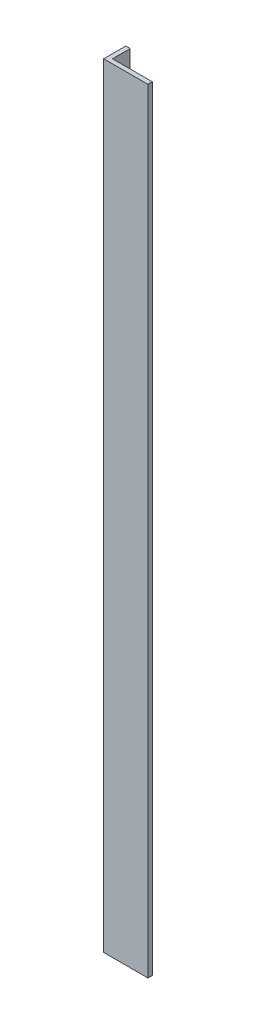
ISO-10303-21;
HEADER;
FILE_DESCRIPTION(('STEP AP214'),'2;1');
FILE_NAME('part.step','',(''),(''),'','','');
FILE_SCHEMA(('AUTOMOTIVE_DESIGN { 1 0 10303 214 1 1 1 1 }'));
ENDSEC;
DATA;
#1=APPLICATION_CONTEXT('core data for automotive mechanical design processes');
#2=APPLICATION_PROTOCOL_DEFINITION('international standard','automotive_design',2000,#1);
#3=PRODUCT_CONTEXT('',#1,'mechanical');
#4=PRODUCT('Part','Part','',(#3));
#5=PRODUCT_RELATED_PRODUCT_CATEGORY('part','',(#4));
#6=PRODUCT_DEFINITION_FORMATION('','',#4);
#7=PRODUCT_DEFINITION_CONTEXT('part definition',#1,'design');
#8=PRODUCT_DEFINITION('design','',#6,#7);
#9=PRODUCT_DEFINITION_SHAPE('','',#8);
#10=(LENGTH_UNIT() NAMED_UNIT(*) SI_UNIT(.MILLI.,.METRE.));
#11=(NAMED_UNIT(*) PLANE_ANGLE_UNIT() SI_UNIT($,.RADIAN.));
#12=(NAMED_UNIT(*) SI_UNIT($,.STERADIAN.) SOLID_ANGLE_UNIT());
#13=UNCERTAINTY_MEASURE_WITH_UNIT(LENGTH_MEASURE(1.E-05),#10,'distance_accuracy_value','');
#14=(GEOMETRIC_REPRESENTATION_CONTEXT(3) GLOBAL_UNCERTAINTY_ASSIGNED_CONTEXT((#13)) GLOBAL_UNIT_ASSIGNED_CONTEXT((#10,
#11,#12)) REPRESENTATION_CONTEXT('',''));
#15=CARTESIAN_POINT('',(0.,0.,0.));
#16=DIRECTION('',(0.,0.,1.));
#17=DIRECTION('',(1.,0.,0.));
#18=AXIS2_PLACEMENT_3D('',#15,#16,#17);
#19=CARTESIAN_POINT('',(0.,0.,0.));
#20=DIRECTION('',(0.,-1.,0.));
#21=DIRECTION('',(0.,0.,-1.));
#22=AXIS2_PLACEMENT_3D('',#19,#20,#21);
#23=PLANE('',#22);
#24=DIRECTION('',(1.,0.,0.));
#25=VECTOR('',#24,1.);
#26=CARTESIAN_POINT('',(20.,0.,0.));
#27=LINE('',#26,#25);
#28=CARTESIAN_POINT('',(0.,0.,0.));
#29=VERTEX_POINT('',#28);
#30=CARTESIAN_POINT('',(20.,0.,0.));
#31=VERTEX_POINT('',#30);
#32=EDGE_CURVE('E100',#29,#31,#27,.T.);
#33=ORIENTED_EDGE('',*,*,#32,.F.);
#34=DIRECTION('',(0.,0.,1.));
#35=VECTOR('',#34,1.);
#36=CARTESIAN_POINT('',(0.,0.,0.));
#37=LINE('',#36,#35);
#38=CARTESIAN_POINT('',(0.,0.,-10.));
#39=VERTEX_POINT('',#38);
#40=EDGE_CURVE('E118',#39,#29,#37,.T.);
#41=ORIENTED_EDGE('',*,*,#40,.F.);
#42=DIRECTION('',(-1.,0.,0.));
#43=VECTOR('',#42,1.);
#44=CARTESIAN_POINT('',(0.,0.,-10.));
#45=LINE('',#44,#43);
#46=CARTESIAN_POINT('',(2.,0.,-10.));
#47=VERTEX_POINT('',#46);
#48=EDGE_CURVE('E115',#47,#39,#45,.T.);
#49=ORIENTED_EDGE('',*,*,#48,.F.);
#50=DIRECTION('',(0.,0.,-1.));
#51=VECTOR('',#50,1.);
#52=CARTESIAN_POINT('',(2.,0.,-10.));
#53=LINE('',#52,#51);
#54=CARTESIAN_POINT('',(2.,0.,-2.));
#55=VERTEX_POINT('',#54);
#56=EDGE_CURVE('E112',#55,#47,#53,.T.);
#57=ORIENTED_EDGE('',*,*,#56,.F.);
#58=DIRECTION('',(-1.,0.,0.));
#59=VECTOR('',#58,1.);
#60=CARTESIAN_POINT('',(2.,0.,-2.));
#61=LINE('',#60,#59);
#62=CARTESIAN_POINT('',(20.,0.,-2.));
#63=VERTEX_POINT('',#62);
#64=EDGE_CURVE('E103',#63,#55,#61,.T.);
#65=ORIENTED_EDGE('',*,*,#64,.F.);
#66=DIRECTION('',(0.,0.,-1.));
#67=VECTOR('',#66,1.);
#68=CARTESIAN_POINT('',(20.,0.,-2.));
#69=LINE('',#68,#67);
#70=EDGE_CURVE('E92',#31,#63,#69,.T.);
#71=ORIENTED_EDGE('',*,*,#70,.F.);
#72=EDGE_LOOP('',(#33,#41,#49,#57,#65,#71));
#73=FACE_BOUND('',#72,.T.);
#74=ADVANCED_FACE('F36',(#73),#23,.T.);
#75=CARTESIAN_POINT('',(0.,372.360679774998,0.));
#76=DIRECTION('',(1.,0.,0.));
#77=DIRECTION('',(0.,0.,-1.));
#78=AXIS2_PLACEMENT_3D('',#75,#76,#77);
#79=PLANE('',#78);
#80=DIRECTION('',(0.,-1.,0.));
#81=VECTOR('',#80,1.);
#82=CARTESIAN_POINT('',(0.,372.360679774998,0.));
#83=LINE('',#82,#81);
#84=CARTESIAN_POINT('',(1.62786450985655E-13,350.,0.));
#85=VERTEX_POINT('',#84);
#86=EDGE_CURVE('E106',#85,#29,#83,.T.);
#87=ORIENTED_EDGE('',*,*,#86,.F.);
#88=DIRECTION('',(0.,0.,-1.));
#89=VECTOR('',#88,1.);
#90=CARTESIAN_POINT('',(0.,350.,0.));
#91=LINE('',#90,#89);
#92=CARTESIAN_POINT('',(0.,350.,-10.));
#93=VERTEX_POINT('',#92);
#94=EDGE_CURVE('E40',#85,#93,#91,.T.);
#95=ORIENTED_EDGE('',*,*,#94,.T.);
#96=DIRECTION('',(0.,-1.,0.));
#97=VECTOR('',#96,1.);
#98=CARTESIAN_POINT('',(0.,372.360679774998,-10.));
#99=LINE('',#98,#97);
#100=EDGE_CURVE('E121',#93,#39,#99,.T.);
#101=ORIENTED_EDGE('',*,*,#100,.T.);
#102=ORIENTED_EDGE('',*,*,#40,.T.);
#103=EDGE_LOOP('',(#87,#95,#101,#102));
#104=FACE_BOUND('',#103,.T.);
#105=ADVANCED_FACE('F140',(#104),#79,.F.);
#106=CARTESIAN_POINT('',(0.,372.360679774998,-10.));
#107=DIRECTION('',(0.,0.,1.));
#108=DIRECTION('',(1.,0.,0.));
#109=AXIS2_PLACEMENT_3D('',#106,#107,#108);
#110=PLANE('',#109);
#111=ORIENTED_EDGE('',*,*,#100,.F.);
#112=DIRECTION('',(1.,0.,0.));
#113=VECTOR('',#112,1.);
#114=CARTESIAN_POINT('',(0.,350.,-10.));
#115=LINE('',#114,#113);
#116=CARTESIAN_POINT('',(2.,350.,-10.));
#117=VERTEX_POINT('',#116);
#118=EDGE_CURVE('E132',#93,#117,#115,.T.);
#119=ORIENTED_EDGE('',*,*,#118,.T.);
#120=DIRECTION('',(0.,-1.,0.));
#121=VECTOR('',#120,1.);
#122=CARTESIAN_POINT('',(2.,372.360679774998,-10.));
#123=LINE('',#122,#121);
#124=EDGE_CURVE('E123',#117,#47,#123,.T.);
#125=ORIENTED_EDGE('',*,*,#124,.T.);
#126=ORIENTED_EDGE('',*,*,#48,.T.);
#127=EDGE_LOOP('',(#111,#119,#125,#126));
#128=FACE_BOUND('',#127,.T.);
#129=ADVANCED_FACE('F143',(#128),#110,.F.);
#130=CARTESIAN_POINT('',(2.,372.360679774998,-10.));
#131=DIRECTION('',(-1.,0.,0.));
#132=DIRECTION('',(0.,0.,1.));
#133=AXIS2_PLACEMENT_3D('',#130,#131,#132);
#134=PLANE('',#133);
#135=ORIENTED_EDGE('',*,*,#124,.F.);
#136=DIRECTION('',(0.,0.,1.));
#137=VECTOR('',#136,1.);
#138=CARTESIAN_POINT('',(2.,350.,-10.));
#139=LINE('',#138,#137);
#140=CARTESIAN_POINT('',(2.,350.,-2.));
#141=VERTEX_POINT('',#140);
#142=EDGE_CURVE('E130',#117,#141,#139,.T.);
#143=ORIENTED_EDGE('',*,*,#142,.T.);
#144=DIRECTION('',(0.,-1.,0.));
#145=VECTOR('',#144,1.);
#146=CARTESIAN_POINT('',(2.,372.360679774998,-2.));
#147=LINE('',#146,#145);
#148=EDGE_CURVE('E125',#141,#55,#147,.T.);
#149=ORIENTED_EDGE('',*,*,#148,.T.);
#150=ORIENTED_EDGE('',*,*,#56,.T.);
#151=EDGE_LOOP('',(#135,#143,#149,#150));
#152=FACE_BOUND('',#151,.T.);
#153=ADVANCED_FACE('F146',(#152),#134,.F.);
#154=CARTESIAN_POINT('',(2.,372.360679774998,-2.));
#155=DIRECTION('',(0.,0.,1.));
#156=DIRECTION('',(1.,0.,0.));
#157=AXIS2_PLACEMENT_3D('',#154,#155,#156);
#158=PLANE('',#157);
#159=ORIENTED_EDGE('',*,*,#148,.F.);
#160=DIRECTION('',(1.,0.,0.));
#161=VECTOR('',#160,1.);
#162=CARTESIAN_POINT('',(2.,350.,-2.));
#163=LINE('',#162,#161);
#164=CARTESIAN_POINT('',(20.,350.,-2.));
#165=VERTEX_POINT('',#164);
#166=EDGE_CURVE('E57',#141,#165,#163,.T.);
#167=ORIENTED_EDGE('',*,*,#166,.T.);
#168=DIRECTION('',(0.,-1.,0.));
#169=VECTOR('',#168,1.);
#170=CARTESIAN_POINT('',(20.,372.360679774998,-2.));
#171=LINE('',#170,#169);
#172=EDGE_CURVE('E96',#165,#63,#171,.T.);
#173=ORIENTED_EDGE('',*,*,#172,.T.);
#174=ORIENTED_EDGE('',*,*,#64,.T.);
#175=EDGE_LOOP('',(#159,#167,#173,#174));
#176=FACE_BOUND('',#175,.T.);
#177=ADVANCED_FACE('F128',(#176),#158,.F.);
#178=CARTESIAN_POINT('',(20.,372.360679774998,-2.));
#179=DIRECTION('',(-1.,0.,0.));
#180=DIRECTION('',(0.,0.,1.));
#181=AXIS2_PLACEMENT_3D('',#178,#179,#180);
#182=PLANE('',#181);
#183=ORIENTED_EDGE('',*,*,#172,.F.);
#184=DIRECTION('',(0.,0.,1.));
#185=VECTOR('',#184,1.);
#186=CARTESIAN_POINT('',(20.,350.,-2.));
#187=LINE('',#186,#185);
#188=CARTESIAN_POINT('',(20.,350.,0.));
#189=VERTEX_POINT('',#188);
#190=EDGE_CURVE('E45',#165,#189,#187,.T.);
#191=ORIENTED_EDGE('',*,*,#190,.T.);
#192=DIRECTION('',(0.,-1.,0.));
#193=VECTOR('',#192,1.);
#194=CARTESIAN_POINT('',(20.,372.360679774998,0.));
#195=LINE('',#194,#193);
#196=EDGE_CURVE('E89',#189,#31,#195,.T.);
#197=ORIENTED_EDGE('',*,*,#196,.T.);
#198=ORIENTED_EDGE('',*,*,#70,.T.);
#199=EDGE_LOOP('',(#183,#191,#197,#198));
#200=FACE_BOUND('',#199,.T.);
#201=ADVANCED_FACE('F91',(#200),#182,.F.);
#202=CARTESIAN_POINT('',(20.,372.360679774998,0.));
#203=DIRECTION('',(0.,0.,-1.));
#204=DIRECTION('',(-1.,0.,0.));
#205=AXIS2_PLACEMENT_3D('',#202,#203,#204);
#206=PLANE('',#205);
#207=ORIENTED_EDGE('',*,*,#196,.F.);
#208=DIRECTION('',(-1.,0.,0.));
#209=VECTOR('',#208,1.);
#210=CARTESIAN_POINT('',(20.,350.,0.));
#211=LINE('',#210,#209);
#212=EDGE_CURVE('E11',#189,#85,#211,.T.);
#213=ORIENTED_EDGE('',*,*,#212,.T.);
#214=ORIENTED_EDGE('',*,*,#86,.T.);
#215=ORIENTED_EDGE('',*,*,#32,.T.);
#216=EDGE_LOOP('',(#207,#213,#214,#215));
#217=FACE_BOUND('',#216,.T.);
#218=ADVANCED_FACE('F38',(#217),#206,.F.);
#219=CARTESIAN_POINT('',(28.0000000000001,350.,-73.9999999999686));
#220=DIRECTION('',(0.,-1.,0.));
#221=DIRECTION('',(1.,0.,0.));
#222=AXIS2_PLACEMENT_3D('',#219,#220,#221);
#223=PLANE('',#222);
#224=ORIENTED_EDGE('',*,*,#190,.F.);
#225=ORIENTED_EDGE('',*,*,#166,.F.);
#226=ORIENTED_EDGE('',*,*,#142,.F.);
#227=ORIENTED_EDGE('',*,*,#118,.F.);
#228=ORIENTED_EDGE('',*,*,#94,.F.);
#229=ORIENTED_EDGE('',*,*,#212,.F.);
#230=EDGE_LOOP('',(#224,#225,#226,#227,#228,#229));
#231=FACE_BOUND('',#230,.T.);
#232=ADVANCED_FACE('F141',(#231),#223,.F.);
#233=CLOSED_SHELL('',(#74,#105,#129,#153,#177,#201,#218,#232));
#234=MANIFOLD_SOLID_BREP('B2',#233);
#235=ADVANCED_BREP_SHAPE_REPRESENTATION('',(#18,#234),#14);
#236=SHAPE_DEFINITION_REPRESENTATION(#9,#235);
ENDSEC;
END-ISO-10303-21;
